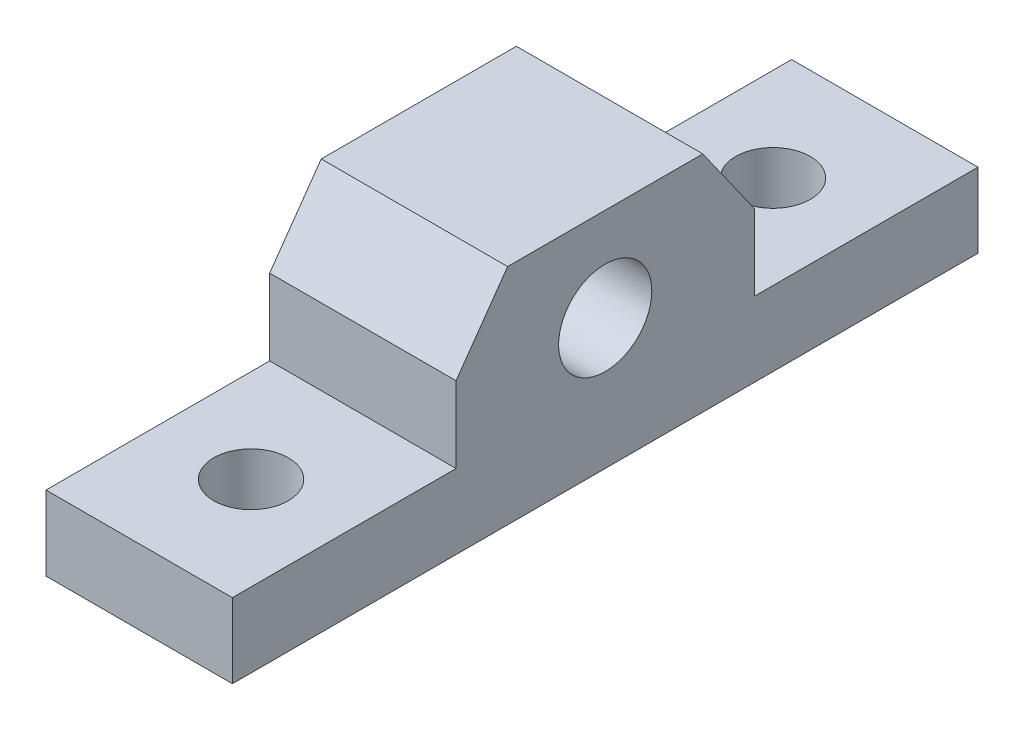
ISO-10303-21;
HEADER;
FILE_DESCRIPTION(('STEP AP214'),'2;1');
FILE_NAME('part.step','',(''),(''),'','','');
FILE_SCHEMA(('AUTOMOTIVE_DESIGN { 1 0 10303 214 1 1 1 1 }'));
ENDSEC;
DATA;
#1=APPLICATION_CONTEXT('core data for automotive mechanical design processes');
#2=APPLICATION_PROTOCOL_DEFINITION('international standard','automotive_design',2000,#1);
#3=PRODUCT_CONTEXT('',#1,'mechanical');
#4=PRODUCT('Part','Part','',(#3));
#5=PRODUCT_RELATED_PRODUCT_CATEGORY('part','',(#4));
#6=PRODUCT_DEFINITION_FORMATION('','',#4);
#7=PRODUCT_DEFINITION_CONTEXT('part definition',#1,'design');
#8=PRODUCT_DEFINITION('design','',#6,#7);
#9=PRODUCT_DEFINITION_SHAPE('','',#8);
#10=(LENGTH_UNIT() NAMED_UNIT(*) SI_UNIT(.MILLI.,.METRE.));
#11=(NAMED_UNIT(*) PLANE_ANGLE_UNIT() SI_UNIT($,.RADIAN.));
#12=(NAMED_UNIT(*) SI_UNIT($,.STERADIAN.) SOLID_ANGLE_UNIT());
#13=UNCERTAINTY_MEASURE_WITH_UNIT(LENGTH_MEASURE(1.E-05),#10,'distance_accuracy_value','');
#14=(GEOMETRIC_REPRESENTATION_CONTEXT(3) GLOBAL_UNCERTAINTY_ASSIGNED_CONTEXT((#13)) GLOBAL_UNIT_ASSIGNED_CONTEXT((#10,
#11,#12)) REPRESENTATION_CONTEXT('',''));
#15=CARTESIAN_POINT('',(0.,0.,0.));
#16=DIRECTION('',(0.,0.,1.));
#17=DIRECTION('',(1.,0.,0.));
#18=AXIS2_PLACEMENT_3D('',#15,#16,#17);
#19=CARTESIAN_POINT('',(10.,9.,0.));
#20=DIRECTION('',(-1.,0.,0.));
#21=DIRECTION('',(0.,0.,1.));
#22=AXIS2_PLACEMENT_3D('',#19,#20,#21);
#23=PLANE('',#22);
#24=DIRECTION('',(0.,-1.,0.));
#25=VECTOR('',#24,1.);
#26=CARTESIAN_POINT('',(10.,5.,0.));
#27=LINE('',#26,#25);
#28=CARTESIAN_POINT('',(10.,9.,0.));
#29=VERTEX_POINT('',#28);
#30=CARTESIAN_POINT('',(10.,5.,0.));
#31=VERTEX_POINT('',#30);
#32=EDGE_CURVE('E159',#29,#31,#27,.T.);
#33=ORIENTED_EDGE('',*,*,#32,.T.);
#34=DIRECTION('',(0.,0.,-1.));
#35=VECTOR('',#34,1.);
#36=CARTESIAN_POINT('',(10.,5.,0.));
#37=LINE('',#36,#35);
#38=CARTESIAN_POINT('',(10.,5.,-40.));
#39=VERTEX_POINT('',#38);
#40=EDGE_CURVE('E97',#31,#39,#37,.T.);
#41=ORIENTED_EDGE('',*,*,#40,.T.);
#42=DIRECTION('',(0.,1.,0.));
#43=VECTOR('',#42,1.);
#44=CARTESIAN_POINT('',(10.,5.,-40.));
#45=LINE('',#44,#43);
#46=CARTESIAN_POINT('',(10.,9.,-40.));
#47=VERTEX_POINT('',#46);
#48=EDGE_CURVE('E180',#39,#47,#45,.T.);
#49=ORIENTED_EDGE('',*,*,#48,.T.);
#50=DIRECTION('',(0.,0.,1.));
#51=VECTOR('',#50,1.);
#52=CARTESIAN_POINT('',(10.,9.,-40.));
#53=LINE('',#52,#51);
#54=CARTESIAN_POINT('',(10.,9.,-28.));
#55=VERTEX_POINT('',#54);
#56=EDGE_CURVE('E199',#47,#55,#53,.T.);
#57=ORIENTED_EDGE('',*,*,#56,.T.);
#58=DIRECTION('',(0.,1.,0.));
#59=VECTOR('',#58,1.);
#60=CARTESIAN_POINT('',(10.,9.,-28.));
#61=LINE('',#60,#59);
#62=CARTESIAN_POINT('',(10.,13.0775072839407,-28.));
#63=VERTEX_POINT('',#62);
#64=EDGE_CURVE('E196',#55,#63,#61,.T.);
#65=ORIENTED_EDGE('',*,*,#64,.T.);
#66=DIRECTION('',(0.,0.817328827389593,0.576171491760876));
#67=VECTOR('',#66,1.);
#68=CARTESIAN_POINT('',(10.,13.0775072839407,-28.));
#69=LINE('',#68,#67);
#70=CARTESIAN_POINT('',(10.,17.,-25.2348601885838));
#71=VERTEX_POINT('',#70);
#72=EDGE_CURVE('E198',#63,#71,#69,.T.);
#73=ORIENTED_EDGE('',*,*,#72,.T.);
#74=DIRECTION('',(0.,0.,1.));
#75=VECTOR('',#74,1.);
#76=CARTESIAN_POINT('',(10.,17.,-14.7651398114162));
#77=LINE('',#76,#75);
#78=CARTESIAN_POINT('',(10.,17.,-14.7651398114162));
#79=VERTEX_POINT('',#78);
#80=EDGE_CURVE('E122',#71,#79,#77,.T.);
#81=ORIENTED_EDGE('',*,*,#80,.T.);
#82=DIRECTION('',(0.,-0.817328827389593,0.576171491760876));
#83=VECTOR('',#82,1.);
#84=CARTESIAN_POINT('',(10.,13.0775072839407,-12.));
#85=LINE('',#84,#83);
#86=CARTESIAN_POINT('',(10.,13.0775072839407,-12.));
#87=VERTEX_POINT('',#86);
#88=EDGE_CURVE('E116',#79,#87,#85,.T.);
#89=ORIENTED_EDGE('',*,*,#88,.T.);
#90=DIRECTION('',(0.,-1.,0.));
#91=VECTOR('',#90,1.);
#92=CARTESIAN_POINT('',(10.,9.,-12.));
#93=LINE('',#92,#91);
#94=CARTESIAN_POINT('',(10.,9.,-12.));
#95=VERTEX_POINT('',#94);
#96=EDGE_CURVE('E120',#87,#95,#93,.T.);
#97=ORIENTED_EDGE('',*,*,#96,.T.);
#98=DIRECTION('',(0.,0.,1.));
#99=VECTOR('',#98,1.);
#100=CARTESIAN_POINT('',(10.,9.,0.));
#101=LINE('',#100,#99);
#102=EDGE_CURVE('E48',#95,#29,#101,.T.);
#103=ORIENTED_EDGE('',*,*,#102,.T.);
#104=EDGE_LOOP('',(#33,#41,#49,#57,#65,#73,#81,#89,#97,#103));
#105=FACE_BOUND('',#104,.T.);
#106=CARTESIAN_POINT('',(10.,12.,-20.));
#107=DIRECTION('',(1.,0.,0.));
#108=DIRECTION('',(0.,0.,-1.));
#109=AXIS2_PLACEMENT_3D('',#106,#107,#108);
#110=CIRCLE('',#109,2.5);
#111=CARTESIAN_POINT('',(10.,12.,-22.5));
#112=VERTEX_POINT('',#111);
#113=EDGE_CURVE('E144',#112,#112,#110,.T.);
#114=ORIENTED_EDGE('',*,*,#113,.F.);
#115=EDGE_LOOP('',(#114));
#116=FACE_BOUND('',#115,.T.);
#117=ADVANCED_FACE('F31',(#105,#116),#23,.F.);
#118=CARTESIAN_POINT('',(0.,9.,0.));
#119=DIRECTION('',(-1.,0.,0.));
#120=DIRECTION('',(0.,0.,1.));
#121=AXIS2_PLACEMENT_3D('',#118,#119,#120);
#122=PLANE('',#121);
#123=DIRECTION('',(0.,-1.,0.));
#124=VECTOR('',#123,1.);
#125=CARTESIAN_POINT('',(0.,5.,0.));
#126=LINE('',#125,#124);
#127=CARTESIAN_POINT('',(0.,9.,0.));
#128=VERTEX_POINT('',#127);
#129=CARTESIAN_POINT('',(0.,5.,0.));
#130=VERTEX_POINT('',#129);
#131=EDGE_CURVE('E140',#128,#130,#126,.T.);
#132=ORIENTED_EDGE('',*,*,#131,.F.);
#133=DIRECTION('',(0.,0.,1.));
#134=VECTOR('',#133,1.);
#135=CARTESIAN_POINT('',(0.,9.,0.));
#136=LINE('',#135,#134);
#137=CARTESIAN_POINT('',(0.,9.,-12.));
#138=VERTEX_POINT('',#137);
#139=EDGE_CURVE('E89',#138,#128,#136,.T.);
#140=ORIENTED_EDGE('',*,*,#139,.F.);
#141=DIRECTION('',(0.,-1.,0.));
#142=VECTOR('',#141,1.);
#143=CARTESIAN_POINT('',(0.,9.,-12.));
#144=LINE('',#143,#142);
#145=CARTESIAN_POINT('',(0.,13.0775072839407,-12.));
#146=VERTEX_POINT('',#145);
#147=EDGE_CURVE('E83',#146,#138,#144,.T.);
#148=ORIENTED_EDGE('',*,*,#147,.F.);
#149=DIRECTION('',(0.,-0.817328827389593,0.576171491760876));
#150=VECTOR('',#149,1.);
#151=CARTESIAN_POINT('',(0.,13.0775072839407,-12.));
#152=LINE('',#151,#150);
#153=CARTESIAN_POINT('',(0.,17.,-14.7651398114162));
#154=VERTEX_POINT('',#153);
#155=EDGE_CURVE('E130',#154,#146,#152,.T.);
#156=ORIENTED_EDGE('',*,*,#155,.F.);
#157=DIRECTION('',(0.,0.,1.));
#158=VECTOR('',#157,1.);
#159=CARTESIAN_POINT('',(0.,17.,-14.7651398114162));
#160=LINE('',#159,#158);
#161=CARTESIAN_POINT('',(0.,17.,-25.2348601885838));
#162=VERTEX_POINT('',#161);
#163=EDGE_CURVE('E154',#162,#154,#160,.T.);
#164=ORIENTED_EDGE('',*,*,#163,.F.);
#165=DIRECTION('',(0.,0.817328827389593,0.576171491760876));
#166=VECTOR('',#165,1.);
#167=CARTESIAN_POINT('',(0.,13.0775072839407,-28.));
#168=LINE('',#167,#166);
#169=CARTESIAN_POINT('',(0.,13.0775072839407,-28.));
#170=VERTEX_POINT('',#169);
#171=EDGE_CURVE('E152',#170,#162,#168,.T.);
#172=ORIENTED_EDGE('',*,*,#171,.F.);
#173=DIRECTION('',(0.,1.,0.));
#174=VECTOR('',#173,1.);
#175=CARTESIAN_POINT('',(0.,9.,-28.));
#176=LINE('',#175,#174);
#177=CARTESIAN_POINT('',(0.,9.,-28.));
#178=VERTEX_POINT('',#177);
#179=EDGE_CURVE('E150',#178,#170,#176,.T.);
#180=ORIENTED_EDGE('',*,*,#179,.F.);
#181=DIRECTION('',(0.,0.,1.));
#182=VECTOR('',#181,1.);
#183=CARTESIAN_POINT('',(0.,9.,-40.));
#184=LINE('',#183,#182);
#185=CARTESIAN_POINT('',(0.,9.,-40.));
#186=VERTEX_POINT('',#185);
#187=EDGE_CURVE('E148',#186,#178,#184,.T.);
#188=ORIENTED_EDGE('',*,*,#187,.F.);
#189=DIRECTION('',(0.,1.,0.));
#190=VECTOR('',#189,1.);
#191=CARTESIAN_POINT('',(0.,5.,-40.));
#192=LINE('',#191,#190);
#193=CARTESIAN_POINT('',(0.,5.,-40.));
#194=VERTEX_POINT('',#193);
#195=EDGE_CURVE('E146',#194,#186,#192,.T.);
#196=ORIENTED_EDGE('',*,*,#195,.F.);
#197=DIRECTION('',(0.,0.,-1.));
#198=VECTOR('',#197,1.);
#199=CARTESIAN_POINT('',(0.,5.,0.));
#200=LINE('',#199,#198);
#201=EDGE_CURVE('E143',#130,#194,#200,.T.);
#202=ORIENTED_EDGE('',*,*,#201,.F.);
#203=EDGE_LOOP('',(#132,#140,#148,#156,#164,#172,#180,#188,#196,#202));
#204=FACE_BOUND('',#203,.T.);
#205=CARTESIAN_POINT('',(0.,12.,-20.));
#206=DIRECTION('',(1.,0.,0.));
#207=DIRECTION('',(0.,0.,-1.));
#208=AXIS2_PLACEMENT_3D('',#205,#206,#207);
#209=CIRCLE('',#208,2.5);
#210=CARTESIAN_POINT('',(0.,12.,-22.5));
#211=VERTEX_POINT('',#210);
#212=EDGE_CURVE('E207',#211,#211,#209,.T.);
#213=ORIENTED_EDGE('',*,*,#212,.T.);
#214=EDGE_LOOP('',(#213));
#215=FACE_BOUND('',#214,.T.);
#216=ADVANCED_FACE('F184',(#204,#215),#122,.T.);
#217=CARTESIAN_POINT('',(10.,5.,0.));
#218=DIRECTION('',(0.,0.,-1.));
#219=DIRECTION('',(-1.,0.,0.));
#220=AXIS2_PLACEMENT_3D('',#217,#218,#219);
#221=PLANE('',#220);
#222=ORIENTED_EDGE('',*,*,#131,.T.);
#223=DIRECTION('',(-1.,0.,0.));
#224=VECTOR('',#223,1.);
#225=CARTESIAN_POINT('',(10.,5.,0.));
#226=LINE('',#225,#224);
#227=EDGE_CURVE('E11',#31,#130,#226,.T.);
#228=ORIENTED_EDGE('',*,*,#227,.F.);
#229=ORIENTED_EDGE('',*,*,#32,.F.);
#230=DIRECTION('',(-1.,0.,0.));
#231=VECTOR('',#230,1.);
#232=CARTESIAN_POINT('',(10.,9.,0.));
#233=LINE('',#232,#231);
#234=EDGE_CURVE('E136',#29,#128,#233,.T.);
#235=ORIENTED_EDGE('',*,*,#234,.T.);
#236=EDGE_LOOP('',(#222,#228,#229,#235));
#237=FACE_BOUND('',#236,.T.);
#238=ADVANCED_FACE('F33',(#237),#221,.F.);
#239=CARTESIAN_POINT('',(10.,5.,0.));
#240=DIRECTION('',(0.,1.,0.));
#241=DIRECTION('',(0.,0.,1.));
#242=AXIS2_PLACEMENT_3D('',#239,#240,#241);
#243=PLANE('',#242);
#244=CARTESIAN_POINT('',(5.,5.,-34.0000000000283));
#245=DIRECTION('',(0.,1.,0.));
#246=DIRECTION('',(0.,0.,-1.));
#247=AXIS2_PLACEMENT_3D('',#244,#245,#246);
#248=CIRCLE('',#247,2.);
#249=CARTESIAN_POINT('',(5.,5.,-36.0000000000283));
#250=VERTEX_POINT('',#249);
#251=EDGE_CURVE('E216',#250,#250,#248,.T.);
#252=ORIENTED_EDGE('',*,*,#251,.T.);
#253=EDGE_LOOP('',(#252));
#254=FACE_BOUND('',#253,.T.);
#255=CARTESIAN_POINT('',(5.,5.,-5.99999999997169));
#256=DIRECTION('',(0.,1.,0.));
#257=DIRECTION('',(0.,0.,1.));
#258=AXIS2_PLACEMENT_3D('',#255,#256,#257);
#259=CIRCLE('',#258,2.);
#260=CARTESIAN_POINT('',(5.,5.,-3.99999999997169));
#261=VERTEX_POINT('',#260);
#262=EDGE_CURVE('E210',#261,#261,#259,.T.);
#263=ORIENTED_EDGE('',*,*,#262,.T.);
#264=EDGE_LOOP('',(#263));
#265=FACE_BOUND('',#264,.T.);
#266=ORIENTED_EDGE('',*,*,#201,.T.);
#267=DIRECTION('',(-1.,0.,0.));
#268=VECTOR('',#267,1.);
#269=CARTESIAN_POINT('',(10.,5.,-40.));
#270=LINE('',#269,#268);
#271=EDGE_CURVE('E40',#39,#194,#270,.T.);
#272=ORIENTED_EDGE('',*,*,#271,.F.);
#273=ORIENTED_EDGE('',*,*,#40,.F.);
#274=ORIENTED_EDGE('',*,*,#227,.T.);
#275=EDGE_LOOP('',(#266,#272,#273,#274));
#276=FACE_BOUND('',#275,.T.);
#277=ADVANCED_FACE('F225',(#254,#265,#276),#243,.F.);
#278=CARTESIAN_POINT('',(10.,5.,-40.));
#279=DIRECTION('',(0.,0.,1.));
#280=DIRECTION('',(1.,0.,0.));
#281=AXIS2_PLACEMENT_3D('',#278,#279,#280);
#282=PLANE('',#281);
#283=ORIENTED_EDGE('',*,*,#195,.T.);
#284=DIRECTION('',(-1.,0.,0.));
#285=VECTOR('',#284,1.);
#286=CARTESIAN_POINT('',(10.,9.,-40.));
#287=LINE('',#286,#285);
#288=EDGE_CURVE('E172',#47,#186,#287,.T.);
#289=ORIENTED_EDGE('',*,*,#288,.F.);
#290=ORIENTED_EDGE('',*,*,#48,.F.);
#291=ORIENTED_EDGE('',*,*,#271,.T.);
#292=EDGE_LOOP('',(#283,#289,#290,#291));
#293=FACE_BOUND('',#292,.T.);
#294=ADVANCED_FACE('F178',(#293),#282,.F.);
#295=CARTESIAN_POINT('',(10.,9.,-40.));
#296=DIRECTION('',(0.,-1.,0.));
#297=DIRECTION('',(0.,0.,-1.));
#298=AXIS2_PLACEMENT_3D('',#295,#296,#297);
#299=PLANE('',#298);
#300=CARTESIAN_POINT('',(5.,9.,-34.0000000000283));
#301=DIRECTION('',(0.,1.,0.));
#302=DIRECTION('',(0.,0.,-1.));
#303=AXIS2_PLACEMENT_3D('',#300,#301,#302);
#304=CIRCLE('',#303,2.);
#305=CARTESIAN_POINT('',(5.,9.,-36.0000000000283));
#306=VERTEX_POINT('',#305);
#307=EDGE_CURVE('E219',#306,#306,#304,.T.);
#308=ORIENTED_EDGE('',*,*,#307,.F.);
#309=EDGE_LOOP('',(#308));
#310=FACE_BOUND('',#309,.T.);
#311=ORIENTED_EDGE('',*,*,#187,.T.);
#312=DIRECTION('',(-1.,0.,0.));
#313=VECTOR('',#312,1.);
#314=CARTESIAN_POINT('',(10.,9.,-28.));
#315=LINE('',#314,#313);
#316=EDGE_CURVE('E169',#55,#178,#315,.T.);
#317=ORIENTED_EDGE('',*,*,#316,.F.);
#318=ORIENTED_EDGE('',*,*,#56,.F.);
#319=ORIENTED_EDGE('',*,*,#288,.T.);
#320=EDGE_LOOP('',(#311,#317,#318,#319));
#321=FACE_BOUND('',#320,.T.);
#322=ADVANCED_FACE('F190',(#310,#321),#299,.F.);
#323=CARTESIAN_POINT('',(10.,9.,-28.));
#324=DIRECTION('',(0.,0.,1.));
#325=DIRECTION('',(1.,0.,0.));
#326=AXIS2_PLACEMENT_3D('',#323,#324,#325);
#327=PLANE('',#326);
#328=ORIENTED_EDGE('',*,*,#179,.T.);
#329=DIRECTION('',(-1.,0.,0.));
#330=VECTOR('',#329,1.);
#331=CARTESIAN_POINT('',(10.,13.0775072839407,-28.));
#332=LINE('',#331,#330);
#333=EDGE_CURVE('E166',#63,#170,#332,.T.);
#334=ORIENTED_EDGE('',*,*,#333,.F.);
#335=ORIENTED_EDGE('',*,*,#64,.F.);
#336=ORIENTED_EDGE('',*,*,#316,.T.);
#337=EDGE_LOOP('',(#328,#334,#335,#336));
#338=FACE_BOUND('',#337,.T.);
#339=ADVANCED_FACE('F194',(#338),#327,.F.);
#340=CARTESIAN_POINT('',(10.,13.0775072839407,-28.));
#341=DIRECTION('',(0.,-0.576171491760876,0.817328827389593));
#342=DIRECTION('',(0.,-0.817328827389593,-0.576171491760876));
#343=AXIS2_PLACEMENT_3D('',#340,#341,#342);
#344=PLANE('',#343);
#345=ORIENTED_EDGE('',*,*,#171,.T.);
#346=DIRECTION('',(-1.,0.,0.));
#347=VECTOR('',#346,1.);
#348=CARTESIAN_POINT('',(10.,17.,-25.2348601885838));
#349=LINE('',#348,#347);
#350=EDGE_CURVE('E163',#71,#162,#349,.T.);
#351=ORIENTED_EDGE('',*,*,#350,.F.);
#352=ORIENTED_EDGE('',*,*,#72,.F.);
#353=ORIENTED_EDGE('',*,*,#333,.T.);
#354=EDGE_LOOP('',(#345,#351,#352,#353));
#355=FACE_BOUND('',#354,.T.);
#356=ADVANCED_FACE('F241',(#355),#344,.F.);
#357=CARTESIAN_POINT('',(10.,17.,-14.7651398114162));
#358=DIRECTION('',(0.,-1.,0.));
#359=DIRECTION('',(0.,0.,-1.));
#360=AXIS2_PLACEMENT_3D('',#357,#358,#359);
#361=PLANE('',#360);
#362=ORIENTED_EDGE('',*,*,#163,.T.);
#363=DIRECTION('',(-1.,0.,0.));
#364=VECTOR('',#363,1.);
#365=CARTESIAN_POINT('',(10.,17.,-14.7651398114162));
#366=LINE('',#365,#364);
#367=EDGE_CURVE('E131',#79,#154,#366,.T.);
#368=ORIENTED_EDGE('',*,*,#367,.F.);
#369=ORIENTED_EDGE('',*,*,#80,.F.);
#370=ORIENTED_EDGE('',*,*,#350,.T.);
#371=EDGE_LOOP('',(#362,#368,#369,#370));
#372=FACE_BOUND('',#371,.T.);
#373=ADVANCED_FACE('F262',(#372),#361,.F.);
#374=CARTESIAN_POINT('',(10.,13.0775072839407,-12.));
#375=DIRECTION('',(0.,-0.576171491760876,-0.817328827389593));
#376=DIRECTION('',(0.,0.817328827389593,-0.576171491760876));
#377=AXIS2_PLACEMENT_3D('',#374,#375,#376);
#378=PLANE('',#377);
#379=ORIENTED_EDGE('',*,*,#155,.T.);
#380=DIRECTION('',(-1.,0.,0.));
#381=VECTOR('',#380,1.);
#382=CARTESIAN_POINT('',(10.,13.0775072839407,-12.));
#383=LINE('',#382,#381);
#384=EDGE_CURVE('E127',#87,#146,#383,.T.);
#385=ORIENTED_EDGE('',*,*,#384,.F.);
#386=ORIENTED_EDGE('',*,*,#88,.F.);
#387=ORIENTED_EDGE('',*,*,#367,.T.);
#388=EDGE_LOOP('',(#379,#385,#386,#387));
#389=FACE_BOUND('',#388,.T.);
#390=ADVANCED_FACE('F128',(#389),#378,.F.);
#391=CARTESIAN_POINT('',(10.,9.,-12.));
#392=DIRECTION('',(0.,0.,-1.));
#393=DIRECTION('',(-1.,0.,0.));
#394=AXIS2_PLACEMENT_3D('',#391,#392,#393);
#395=PLANE('',#394);
#396=ORIENTED_EDGE('',*,*,#147,.T.);
#397=DIRECTION('',(-1.,0.,0.));
#398=VECTOR('',#397,1.);
#399=CARTESIAN_POINT('',(10.,9.,-12.));
#400=LINE('',#399,#398);
#401=EDGE_CURVE('E132',#95,#138,#400,.T.);
#402=ORIENTED_EDGE('',*,*,#401,.F.);
#403=ORIENTED_EDGE('',*,*,#96,.F.);
#404=ORIENTED_EDGE('',*,*,#384,.T.);
#405=EDGE_LOOP('',(#396,#402,#403,#404));
#406=FACE_BOUND('',#405,.T.);
#407=ADVANCED_FACE('F134',(#406),#395,.F.);
#408=CARTESIAN_POINT('',(10.,9.,0.));
#409=DIRECTION('',(0.,-1.,0.));
#410=DIRECTION('',(0.,0.,-1.));
#411=AXIS2_PLACEMENT_3D('',#408,#409,#410);
#412=PLANE('',#411);
#413=CARTESIAN_POINT('',(5.,9.,-5.99999999997169));
#414=DIRECTION('',(0.,1.,0.));
#415=DIRECTION('',(0.,0.,1.));
#416=AXIS2_PLACEMENT_3D('',#413,#414,#415);
#417=CIRCLE('',#416,2.);
#418=CARTESIAN_POINT('',(5.,9.,-3.99999999997169));
#419=VERTEX_POINT('',#418);
#420=EDGE_CURVE('E213',#419,#419,#417,.T.);
#421=ORIENTED_EDGE('',*,*,#420,.F.);
#422=EDGE_LOOP('',(#421));
#423=FACE_BOUND('',#422,.T.);
#424=ORIENTED_EDGE('',*,*,#139,.T.);
#425=ORIENTED_EDGE('',*,*,#234,.F.);
#426=ORIENTED_EDGE('',*,*,#102,.F.);
#427=ORIENTED_EDGE('',*,*,#401,.T.);
#428=EDGE_LOOP('',(#424,#425,#426,#427));
#429=FACE_BOUND('',#428,.T.);
#430=ADVANCED_FACE('F254',(#423,#429),#412,.F.);
#431=CARTESIAN_POINT('',(10.,12.,-20.));
#432=DIRECTION('',(-1.,0.,0.));
#433=DIRECTION('',(0.,0.,1.));
#434=AXIS2_PLACEMENT_3D('',#431,#432,#433);
#435=CYLINDRICAL_SURFACE('',#434,2.5);
#436=ORIENTED_EDGE('',*,*,#113,.T.);
#437=EDGE_LOOP('',(#436));
#438=FACE_BOUND('',#437,.T.);
#439=ORIENTED_EDGE('',*,*,#212,.F.);
#440=EDGE_LOOP('',(#439));
#441=FACE_BOUND('',#440,.T.);
#442=ADVANCED_FACE('F251',(#438,#441),#435,.F.);
#443=CARTESIAN_POINT('',(5.,5.,-5.99999999997169));
#444=DIRECTION('',(0.,1.,0.));
#445=DIRECTION('',(0.,0.,1.));
#446=AXIS2_PLACEMENT_3D('',#443,#444,#445);
#447=CYLINDRICAL_SURFACE('',#446,2.);
#448=ORIENTED_EDGE('',*,*,#262,.F.);
#449=EDGE_LOOP('',(#448));
#450=FACE_BOUND('',#449,.T.);
#451=ORIENTED_EDGE('',*,*,#420,.T.);
#452=EDGE_LOOP('',(#451));
#453=FACE_BOUND('',#452,.T.);
#454=ADVANCED_FACE('F231',(#450,#453),#447,.F.);
#455=CARTESIAN_POINT('',(5.,5.,-34.0000000000283));
#456=DIRECTION('',(0.,1.,0.));
#457=DIRECTION('',(0.,0.,1.));
#458=AXIS2_PLACEMENT_3D('',#455,#456,#457);
#459=CYLINDRICAL_SURFACE('',#458,2.);
#460=ORIENTED_EDGE('',*,*,#251,.F.);
#461=EDGE_LOOP('',(#460));
#462=FACE_BOUND('',#461,.T.);
#463=ORIENTED_EDGE('',*,*,#307,.T.);
#464=EDGE_LOOP('',(#463));
#465=FACE_BOUND('',#464,.T.);
#466=ADVANCED_FACE('F228',(#462,#465),#459,.F.);
#467=CLOSED_SHELL('',(#117,#216,#238,#277,#294,#322,#339,#356,#373,#390,#407,#430,#442,#454,#466));
#468=MANIFOLD_SOLID_BREP('B2',#467);
#469=ADVANCED_BREP_SHAPE_REPRESENTATION('',(#18,#468),#14);
#470=SHAPE_DEFINITION_REPRESENTATION(#9,#469);
ENDSEC;
END-ISO-10303-21;
